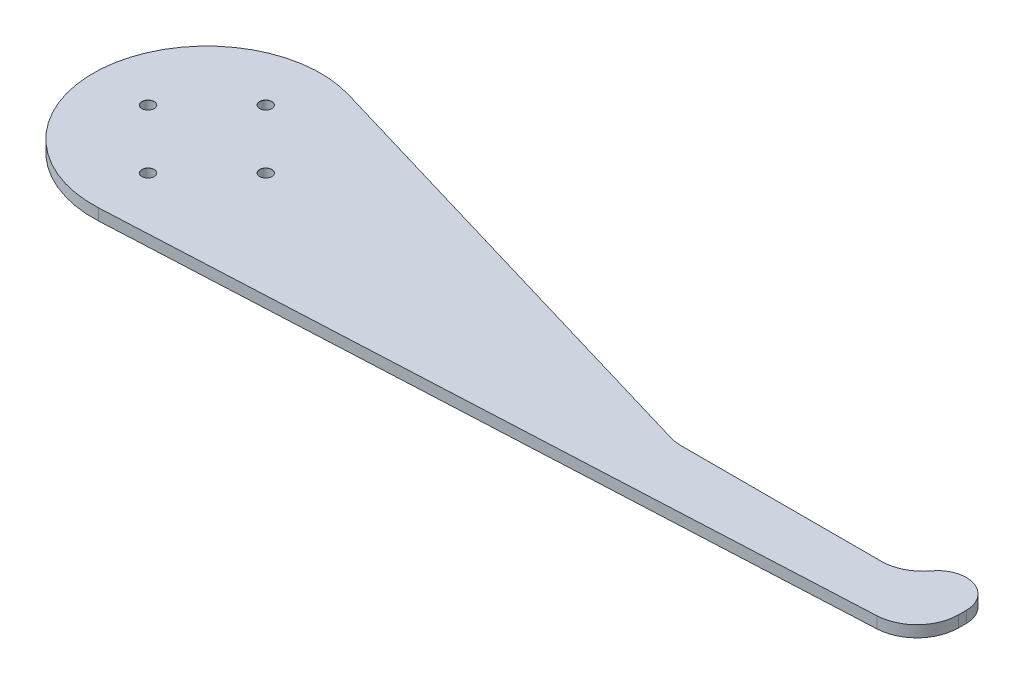
ISO-10303-21;
HEADER;
FILE_DESCRIPTION(('STEP AP214'),'2;1');
FILE_NAME('part.step','',(''),(''),'','','');
FILE_SCHEMA(('AUTOMOTIVE_DESIGN { 1 0 10303 214 1 1 1 1 }'));
ENDSEC;
DATA;
#1=APPLICATION_CONTEXT('core data for automotive mechanical design processes');
#2=APPLICATION_PROTOCOL_DEFINITION('international standard','automotive_design',2000,#1);
#3=PRODUCT_CONTEXT('',#1,'mechanical');
#4=PRODUCT('Part','Part','',(#3));
#5=PRODUCT_RELATED_PRODUCT_CATEGORY('part','',(#4));
#6=PRODUCT_DEFINITION_FORMATION('','',#4);
#7=PRODUCT_DEFINITION_CONTEXT('part definition',#1,'design');
#8=PRODUCT_DEFINITION('design','',#6,#7);
#9=PRODUCT_DEFINITION_SHAPE('','',#8);
#10=(LENGTH_UNIT() NAMED_UNIT(*) SI_UNIT(.MILLI.,.METRE.));
#11=(NAMED_UNIT(*) PLANE_ANGLE_UNIT() SI_UNIT($,.RADIAN.));
#12=(NAMED_UNIT(*) SI_UNIT($,.STERADIAN.) SOLID_ANGLE_UNIT());
#13=UNCERTAINTY_MEASURE_WITH_UNIT(LENGTH_MEASURE(1.E-05),#10,'distance_accuracy_value','');
#14=(GEOMETRIC_REPRESENTATION_CONTEXT(3) GLOBAL_UNCERTAINTY_ASSIGNED_CONTEXT((#13)) GLOBAL_UNIT_ASSIGNED_CONTEXT((#10,
#11,#12)) REPRESENTATION_CONTEXT('',''));
#15=CARTESIAN_POINT('',(0.,0.,0.));
#16=DIRECTION('',(0.,0.,1.));
#17=DIRECTION('',(1.,0.,0.));
#18=AXIS2_PLACEMENT_3D('',#15,#16,#17);
#19=CARTESIAN_POINT('',(0.,3.,0.));
#20=DIRECTION('',(0.,-1.,0.));
#21=DIRECTION('',(0.,0.,-1.));
#22=AXIS2_PLACEMENT_3D('',#19,#20,#21);
#23=CYLINDRICAL_SURFACE('',#22,30.);
#24=CARTESIAN_POINT('',(0.,0.,0.));
#25=DIRECTION('',(0.,1.,0.));
#26=DIRECTION('',(0.,0.,1.));
#27=AXIS2_PLACEMENT_3D('',#24,#25,#26);
#28=CIRCLE('',#27,30.);
#29=CARTESIAN_POINT('',(8.52962376563635,0.,-28.7618761282482));
#30=VERTEX_POINT('',#29);
#31=CARTESIAN_POINT('',(1.4504800602818,0.,29.9649146101691));
#32=VERTEX_POINT('',#31);
#33=EDGE_CURVE('E244',#30,#32,#28,.T.);
#34=ORIENTED_EDGE('',*,*,#33,.T.);
#35=DIRECTION('',(0.,-1.,0.));
#36=VECTOR('',#35,1.);
#37=CARTESIAN_POINT('',(1.4504800602818,3.,29.9649146101691));
#38=LINE('',#37,#36);
#39=CARTESIAN_POINT('',(1.4504800602818,3.,29.9649146101691));
#40=VERTEX_POINT('',#39);
#41=EDGE_CURVE('E149',#40,#32,#38,.T.);
#42=ORIENTED_EDGE('',*,*,#41,.F.);
#43=CARTESIAN_POINT('',(0.,3.,0.));
#44=DIRECTION('',(0.,1.,0.));
#45=DIRECTION('',(0.,0.,1.));
#46=AXIS2_PLACEMENT_3D('',#43,#44,#45);
#47=CIRCLE('',#46,30.);
#48=CARTESIAN_POINT('',(8.52962376563635,3.,-28.7618761282482));
#49=VERTEX_POINT('',#48);
#50=EDGE_CURVE('E135',#49,#40,#47,.T.);
#51=ORIENTED_EDGE('',*,*,#50,.F.);
#52=DIRECTION('',(0.,-1.,0.));
#53=VECTOR('',#52,1.);
#54=CARTESIAN_POINT('',(8.52962376563635,3.,-28.7618761282482));
#55=LINE('',#54,#53);
#56=EDGE_CURVE('E147',#49,#30,#55,.T.);
#57=ORIENTED_EDGE('',*,*,#56,.T.);
#58=EDGE_LOOP('',(#34,#42,#51,#57));
#59=FACE_BOUND('',#58,.T.);
#60=ADVANCED_FACE('F60',(#59),#23,.T.);
#61=CARTESIAN_POINT('',(1.4504800602818,3.,29.9649146101691));
#62=DIRECTION('',(0.0483493353427266,0.,0.998830487005636));
#63=DIRECTION('',(0.998830487005636,0.,-0.0483493353427266));
#64=AXIS2_PLACEMENT_3D('',#61,#62,#63);
#65=PLANE('',#64);
#66=DIRECTION('',(-0.998830487005636,0.,0.0483493353427266));
#67=VECTOR('',#66,1.);
#68=CARTESIAN_POINT('',(1.4504800602818,0.,29.9649146101691));
#69=LINE('',#68,#67);
#70=CARTESIAN_POINT('',(197.03184268877,0.,20.4976135900924));
#71=VERTEX_POINT('',#70);
#72=EDGE_CURVE('E246',#71,#32,#69,.T.);
#73=ORIENTED_EDGE('',*,*,#72,.F.);
#74=DIRECTION('',(0.,-1.,0.));
#75=VECTOR('',#74,1.);
#76=CARTESIAN_POINT('',(197.03184268877,3.,20.4976135900924));
#77=LINE('',#76,#75);
#78=CARTESIAN_POINT('',(197.03184268877,3.,20.4976135900924));
#79=VERTEX_POINT('',#78);
#80=EDGE_CURVE('E172',#71,#79,#77,.F.);
#81=ORIENTED_EDGE('',*,*,#80,.T.);
#82=DIRECTION('',(-0.998830487005636,0.,0.0483493353427266));
#83=VECTOR('',#82,1.);
#84=CARTESIAN_POINT('',(1.4504800602818,3.,29.9649146101691));
#85=LINE('',#84,#83);
#86=EDGE_CURVE('E150',#79,#40,#85,.T.);
#87=ORIENTED_EDGE('',*,*,#86,.T.);
#88=ORIENTED_EDGE('',*,*,#41,.T.);
#89=EDGE_LOOP('',(#73,#81,#87,#88));
#90=FACE_BOUND('',#89,.T.);
#91=ADVANCED_FACE('F203',(#90),#65,.T.);
#92=CARTESIAN_POINT('',(207.5,3.,0.));
#93=DIRECTION('',(1.,0.,0.));
#94=DIRECTION('',(0.,0.,-1.));
#95=AXIS2_PLACEMENT_3D('',#92,#93,#94);
#96=PLANE('',#95);
#97=DIRECTION('',(0.,0.,1.));
#98=VECTOR('',#97,1.);
#99=CARTESIAN_POINT('',(207.5,3.,0.));
#100=LINE('',#99,#98);
#101=CARTESIAN_POINT('',(207.5,3.,7.5));
#102=VERTEX_POINT('',#101);
#103=CARTESIAN_POINT('',(207.5,3.,9.51047823303036));
#104=VERTEX_POINT('',#103);
#105=EDGE_CURVE('E234',#102,#104,#100,.T.);
#106=ORIENTED_EDGE('',*,*,#105,.T.);
#107=DIRECTION('',(0.,-1.,0.));
#108=VECTOR('',#107,1.);
#109=CARTESIAN_POINT('',(207.5,3.,9.51047823303036));
#110=LINE('',#109,#108);
#111=CARTESIAN_POINT('',(207.5,0.,9.51047823303036));
#112=VERTEX_POINT('',#111);
#113=EDGE_CURVE('E156',#104,#112,#110,.T.);
#114=ORIENTED_EDGE('',*,*,#113,.T.);
#115=DIRECTION('',(0.,0.,1.));
#116=VECTOR('',#115,1.);
#117=CARTESIAN_POINT('',(207.5,0.,0.));
#118=LINE('',#117,#116);
#119=CARTESIAN_POINT('',(207.5,0.,7.5));
#120=VERTEX_POINT('',#119);
#121=EDGE_CURVE('E193',#120,#112,#118,.T.);
#122=ORIENTED_EDGE('',*,*,#121,.F.);
#123=DIRECTION('',(0.,-1.,0.));
#124=VECTOR('',#123,1.);
#125=CARTESIAN_POINT('',(207.5,3.,7.5));
#126=LINE('',#125,#124);
#127=EDGE_CURVE('E161',#102,#120,#126,.T.);
#128=ORIENTED_EDGE('',*,*,#127,.F.);
#129=EDGE_LOOP('',(#106,#114,#122,#128));
#130=FACE_BOUND('',#129,.T.);
#131=ADVANCED_FACE('F208',(#130),#96,.T.);
#132=CARTESIAN_POINT('',(0.,3.,7.5));
#133=DIRECTION('',(0.,0.,1.));
#134=DIRECTION('',(1.,0.,0.));
#135=AXIS2_PLACEMENT_3D('',#132,#133,#134);
#136=PLANE('',#135);
#137=DIRECTION('',(-1.,0.,0.));
#138=VECTOR('',#137,1.);
#139=CARTESIAN_POINT('',(0.,3.,7.5));
#140=LINE('',#139,#138);
#141=CARTESIAN_POINT('',(185.125525219356,3.,7.5));
#142=VERTEX_POINT('',#141);
#143=CARTESIAN_POINT('',(132.401318578778,3.,7.5));
#144=VERTEX_POINT('',#143);
#145=EDGE_CURVE('E238',#142,#144,#140,.T.);
#146=ORIENTED_EDGE('',*,*,#145,.F.);
#147=DIRECTION('',(0.,1.,0.));
#148=VECTOR('',#147,1.);
#149=CARTESIAN_POINT('',(185.125525219356,0.,7.5));
#150=LINE('',#149,#148);
#151=CARTESIAN_POINT('',(185.125525219356,0.,7.5));
#152=VERTEX_POINT('',#151);
#153=EDGE_CURVE('E177',#142,#152,#150,.F.);
#154=ORIENTED_EDGE('',*,*,#153,.T.);
#155=DIRECTION('',(-1.,0.,0.));
#156=VECTOR('',#155,1.);
#157=CARTESIAN_POINT('',(0.,0.,7.5));
#158=LINE('',#157,#156);
#159=CARTESIAN_POINT('',(132.401318578778,0.,7.5));
#160=VERTEX_POINT('',#159);
#161=EDGE_CURVE('E142',#152,#160,#158,.T.);
#162=ORIENTED_EDGE('',*,*,#161,.T.);
#163=DIRECTION('',(0.,-1.,0.));
#164=VECTOR('',#163,1.);
#165=CARTESIAN_POINT('',(132.401318578778,3.,7.5));
#166=LINE('',#165,#164);
#167=EDGE_CURVE('E75',#160,#144,#166,.F.);
#168=ORIENTED_EDGE('',*,*,#167,.T.);
#169=EDGE_LOOP('',(#146,#154,#162,#168));
#170=FACE_BOUND('',#169,.T.);
#171=ADVANCED_FACE('F191',(#170),#136,.F.);
#172=CARTESIAN_POINT('',(8.52962376563635,3.,-28.7618761282482));
#173=DIRECTION('',(-0.284320792187878,0.,0.958729204274939));
#174=DIRECTION('',(0.958729204274939,0.,0.284320792187878));
#175=AXIS2_PLACEMENT_3D('',#172,#173,#174);
#176=PLANE('',#175);
#177=DIRECTION('',(-0.958729204274939,0.,-0.284320792187878));
#178=VECTOR('',#177,1.);
#179=CARTESIAN_POINT('',(8.52962376563635,3.,-28.7618761282482));
#180=LINE('',#179,#178);
#181=CARTESIAN_POINT('',(129.273789864711,3.,7.04602124702433));
#182=VERTEX_POINT('',#181);
#183=EDGE_CURVE('E131',#182,#49,#180,.T.);
#184=ORIENTED_EDGE('',*,*,#183,.F.);
#185=DIRECTION('',(0.,-1.,0.));
#186=VECTOR('',#185,1.);
#187=CARTESIAN_POINT('',(129.273789864711,0.,7.04602124702433));
#188=LINE('',#187,#186);
#189=CARTESIAN_POINT('',(129.273789864711,0.,7.04602124702433));
#190=VERTEX_POINT('',#189);
#191=EDGE_CURVE('E182',#182,#190,#188,.T.);
#192=ORIENTED_EDGE('',*,*,#191,.T.);
#193=DIRECTION('',(-0.958729204274939,0.,-0.284320792187878));
#194=VECTOR('',#193,1.);
#195=CARTESIAN_POINT('',(8.52962376563635,0.,-28.7618761282482));
#196=LINE('',#195,#194);
#197=EDGE_CURVE('E154',#190,#30,#196,.T.);
#198=ORIENTED_EDGE('',*,*,#197,.T.);
#199=ORIENTED_EDGE('',*,*,#56,.F.);
#200=EDGE_LOOP('',(#184,#192,#198,#199));
#201=FACE_BOUND('',#200,.T.);
#202=ADVANCED_FACE('F152',(#201),#176,.F.);
#203=CARTESIAN_POINT('',(0.,0.,0.));
#204=DIRECTION('',(0.,1.,0.));
#205=DIRECTION('',(0.,0.,1.));
#206=AXIS2_PLACEMENT_3D('',#203,#204,#205);
#207=PLANE('',#206);
#208=CARTESIAN_POINT('',(0.,0.,-15.5));
#209=DIRECTION('',(0.,1.,0.));
#210=DIRECTION('',(0.,0.,1.));
#211=AXIS2_PLACEMENT_3D('',#208,#209,#210);
#212=CIRCLE('',#211,1.6);
#213=CARTESIAN_POINT('',(0.,0.,-13.9));
#214=VERTEX_POINT('',#213);
#215=EDGE_CURVE('E278',#214,#214,#212,.T.);
#216=ORIENTED_EDGE('',*,*,#215,.T.);
#217=EDGE_LOOP('',(#216));
#218=FACE_BOUND('',#217,.T.);
#219=CARTESIAN_POINT('',(15.5,0.,0.));
#220=DIRECTION('',(0.,1.,0.));
#221=DIRECTION('',(0.,0.,1.));
#222=AXIS2_PLACEMENT_3D('',#219,#220,#221);
#223=CIRCLE('',#222,1.6);
#224=CARTESIAN_POINT('',(15.5,0.,1.6));
#225=VERTEX_POINT('',#224);
#226=EDGE_CURVE('E269',#225,#225,#223,.T.);
#227=ORIENTED_EDGE('',*,*,#226,.T.);
#228=EDGE_LOOP('',(#227));
#229=FACE_BOUND('',#228,.T.);
#230=CARTESIAN_POINT('',(0.,0.,15.5));
#231=DIRECTION('',(0.,1.,0.));
#232=DIRECTION('',(0.,0.,1.));
#233=AXIS2_PLACEMENT_3D('',#230,#231,#232);
#234=CIRCLE('',#233,1.6);
#235=CARTESIAN_POINT('',(0.,0.,17.1));
#236=VERTEX_POINT('',#235);
#237=EDGE_CURVE('E260',#236,#236,#234,.T.);
#238=ORIENTED_EDGE('',*,*,#237,.T.);
#239=EDGE_LOOP('',(#238));
#240=FACE_BOUND('',#239,.T.);
#241=CARTESIAN_POINT('',(-15.5,0.,0.));
#242=DIRECTION('',(0.,1.,0.));
#243=DIRECTION('',(0.,0.,1.));
#244=AXIS2_PLACEMENT_3D('',#241,#242,#243);
#245=CIRCLE('',#244,1.6);
#246=CARTESIAN_POINT('',(-15.5,0.,1.6));
#247=VERTEX_POINT('',#246);
#248=EDGE_CURVE('E169',#247,#247,#245,.T.);
#249=ORIENTED_EDGE('',*,*,#248,.T.);
#250=EDGE_LOOP('',(#249));
#251=FACE_BOUND('',#250,.T.);
#252=ORIENTED_EDGE('',*,*,#121,.T.);
#253=CARTESIAN_POINT('',(196.5,0.,9.51047823303036));
#254=DIRECTION('',(0.,1.,0.));
#255=DIRECTION('',(0.,0.,1.));
#256=AXIS2_PLACEMENT_3D('',#253,#254,#255);
#257=CIRCLE('',#256,11.);
#258=EDGE_CURVE('E159',#112,#71,#257,.F.);
#259=ORIENTED_EDGE('',*,*,#258,.T.);
#260=ORIENTED_EDGE('',*,*,#72,.T.);
#261=ORIENTED_EDGE('',*,*,#33,.F.);
#262=ORIENTED_EDGE('',*,*,#197,.F.);
#263=CARTESIAN_POINT('',(132.401318578778,0.,-3.5));
#264=DIRECTION('',(0.,1.,0.));
#265=DIRECTION('',(0.,0.,1.));
#266=AXIS2_PLACEMENT_3D('',#263,#264,#265);
#267=CIRCLE('',#266,11.);
#268=EDGE_CURVE('E68',#190,#160,#267,.T.);
#269=ORIENTED_EDGE('',*,*,#268,.T.);
#270=ORIENTED_EDGE('',*,*,#161,.F.);
#271=CARTESIAN_POINT('',(185.125525219356,0.,-3.5));
#272=DIRECTION('',(0.,1.,0.));
#273=DIRECTION('',(0.,0.,1.));
#274=AXIS2_PLACEMENT_3D('',#271,#272,#273);
#275=CIRCLE('',#274,11.);
#276=CARTESIAN_POINT('',(193.969807521361,0.,3.04054054054054));
#277=VERTEX_POINT('',#276);
#278=EDGE_CURVE('E184',#152,#277,#275,.T.);
#279=ORIENTED_EDGE('',*,*,#278,.T.);
#280=CARTESIAN_POINT('',(200.,0.,7.5));
#281=DIRECTION('',(0.,1.,0.));
#282=DIRECTION('',(0.,0.,1.));
#283=AXIS2_PLACEMENT_3D('',#280,#281,#282);
#284=CIRCLE('',#283,7.50000000000001);
#285=EDGE_CURVE('E167',#120,#277,#284,.T.);
#286=ORIENTED_EDGE('',*,*,#285,.F.);
#287=EDGE_LOOP('',(#252,#259,#260,#261,#262,#269,#270,#279,#286));
#288=FACE_BOUND('',#287,.T.);
#289=ADVANCED_FACE('F189',(#218,#229,#240,#251,#288),#207,.F.);
#290=CARTESIAN_POINT('',(0.,3.,0.));
#291=DIRECTION('',(0.,1.,0.));
#292=DIRECTION('',(0.,0.,1.));
#293=AXIS2_PLACEMENT_3D('',#290,#291,#292);
#294=PLANE('',#293);
#295=CARTESIAN_POINT('',(0.,3.,-15.5));
#296=DIRECTION('',(0.,1.,0.));
#297=DIRECTION('',(0.,0.,1.));
#298=AXIS2_PLACEMENT_3D('',#295,#296,#297);
#299=CIRCLE('',#298,1.625);
#300=CARTESIAN_POINT('',(0.,3.,-13.875));
#301=VERTEX_POINT('',#300);
#302=EDGE_CURVE('E284',#301,#301,#299,.T.);
#303=ORIENTED_EDGE('',*,*,#302,.F.);
#304=EDGE_LOOP('',(#303));
#305=FACE_BOUND('',#304,.T.);
#306=CARTESIAN_POINT('',(15.5,3.,0.));
#307=DIRECTION('',(0.,1.,0.));
#308=DIRECTION('',(0.,0.,1.));
#309=AXIS2_PLACEMENT_3D('',#306,#307,#308);
#310=CIRCLE('',#309,1.625);
#311=CARTESIAN_POINT('',(15.5,3.,1.625));
#312=VERTEX_POINT('',#311);
#313=EDGE_CURVE('E275',#312,#312,#310,.T.);
#314=ORIENTED_EDGE('',*,*,#313,.F.);
#315=EDGE_LOOP('',(#314));
#316=FACE_BOUND('',#315,.T.);
#317=CARTESIAN_POINT('',(0.,3.,15.5));
#318=DIRECTION('',(0.,1.,0.));
#319=DIRECTION('',(0.,0.,1.));
#320=AXIS2_PLACEMENT_3D('',#317,#318,#319);
#321=CIRCLE('',#320,1.625);
#322=CARTESIAN_POINT('',(0.,3.,17.125));
#323=VERTEX_POINT('',#322);
#324=EDGE_CURVE('E266',#323,#323,#321,.T.);
#325=ORIENTED_EDGE('',*,*,#324,.F.);
#326=EDGE_LOOP('',(#325));
#327=FACE_BOUND('',#326,.T.);
#328=CARTESIAN_POINT('',(-15.5,3.,0.));
#329=DIRECTION('',(0.,1.,0.));
#330=DIRECTION('',(0.,0.,1.));
#331=AXIS2_PLACEMENT_3D('',#328,#329,#330);
#332=CIRCLE('',#331,1.625);
#333=CARTESIAN_POINT('',(-15.5,3.,1.625));
#334=VERTEX_POINT('',#333);
#335=EDGE_CURVE('E257',#334,#334,#332,.T.);
#336=ORIENTED_EDGE('',*,*,#335,.F.);
#337=EDGE_LOOP('',(#336));
#338=FACE_BOUND('',#337,.T.);
#339=ORIENTED_EDGE('',*,*,#86,.F.);
#340=CARTESIAN_POINT('',(196.5,3.,9.51047823303036));
#341=DIRECTION('',(0.,1.,0.));
#342=DIRECTION('',(0.,0.,1.));
#343=AXIS2_PLACEMENT_3D('',#340,#341,#342);
#344=CIRCLE('',#343,11.);
#345=EDGE_CURVE('E174',#79,#104,#344,.T.);
#346=ORIENTED_EDGE('',*,*,#345,.T.);
#347=ORIENTED_EDGE('',*,*,#105,.F.);
#348=CARTESIAN_POINT('',(200.,3.,7.5));
#349=DIRECTION('',(0.,1.,0.));
#350=DIRECTION('',(0.,0.,1.));
#351=AXIS2_PLACEMENT_3D('',#348,#349,#350);
#352=CIRCLE('',#351,7.50000000000001);
#353=CARTESIAN_POINT('',(193.969807521361,3.,3.04054054054054));
#354=VERTEX_POINT('',#353);
#355=EDGE_CURVE('E165',#102,#354,#352,.T.);
#356=ORIENTED_EDGE('',*,*,#355,.T.);
#357=CARTESIAN_POINT('',(185.125525219356,3.,-3.5));
#358=DIRECTION('',(0.,1.,0.));
#359=DIRECTION('',(0.,0.,1.));
#360=AXIS2_PLACEMENT_3D('',#357,#358,#359);
#361=CIRCLE('',#360,11.);
#362=EDGE_CURVE('E82',#354,#142,#361,.F.);
#363=ORIENTED_EDGE('',*,*,#362,.T.);
#364=ORIENTED_EDGE('',*,*,#145,.T.);
#365=CARTESIAN_POINT('',(132.401318578778,3.,-3.5));
#366=DIRECTION('',(0.,1.,0.));
#367=DIRECTION('',(0.,0.,1.));
#368=AXIS2_PLACEMENT_3D('',#365,#366,#367);
#369=CIRCLE('',#368,11.);
#370=EDGE_CURVE('E12',#144,#182,#369,.F.);
#371=ORIENTED_EDGE('',*,*,#370,.T.);
#372=ORIENTED_EDGE('',*,*,#183,.T.);
#373=ORIENTED_EDGE('',*,*,#50,.T.);
#374=EDGE_LOOP('',(#339,#346,#347,#356,#363,#364,#371,#372,#373));
#375=FACE_BOUND('',#374,.T.);
#376=ADVANCED_FACE('F134',(#305,#316,#327,#338,#375),#294,.T.);
#377=CARTESIAN_POINT('',(200.,3.,7.5));
#378=DIRECTION('',(0.,-1.,0.));
#379=DIRECTION('',(0.,0.,-1.));
#380=AXIS2_PLACEMENT_3D('',#377,#378,#379);
#381=CYLINDRICAL_SURFACE('',#380,7.50000000000001);
#382=ORIENTED_EDGE('',*,*,#285,.T.);
#383=DIRECTION('',(0.,-1.,0.));
#384=VECTOR('',#383,1.);
#385=CARTESIAN_POINT('',(193.969807521361,3.,3.04054054054054));
#386=LINE('',#385,#384);
#387=EDGE_CURVE('E180',#277,#354,#386,.F.);
#388=ORIENTED_EDGE('',*,*,#387,.T.);
#389=ORIENTED_EDGE('',*,*,#355,.F.);
#390=ORIENTED_EDGE('',*,*,#127,.T.);
#391=EDGE_LOOP('',(#382,#388,#389,#390));
#392=FACE_BOUND('',#391,.T.);
#393=ADVANCED_FACE('F215',(#392),#381,.T.);
#394=CARTESIAN_POINT('',(-15.5,3.,0.));
#395=DIRECTION('',(0.,1.,0.));
#396=DIRECTION('',(0.,0.,1.));
#397=AXIS2_PLACEMENT_3D('',#394,#395,#396);
#398=CYLINDRICAL_SURFACE('',#397,1.6);
#399=ORIENTED_EDGE('',*,*,#248,.F.);
#400=EDGE_LOOP('',(#399));
#401=FACE_BOUND('',#400,.T.);
#402=CARTESIAN_POINT('',(-15.5,2.975,0.));
#403=DIRECTION('',(0.,1.,0.));
#404=DIRECTION('',(0.,0.,1.));
#405=AXIS2_PLACEMENT_3D('',#402,#403,#404);
#406=CIRCLE('',#405,1.6);
#407=CARTESIAN_POINT('',(-15.5,2.975,1.6));
#408=VERTEX_POINT('',#407);
#409=EDGE_CURVE('E254',#408,#408,#406,.T.);
#410=ORIENTED_EDGE('',*,*,#409,.T.);
#411=EDGE_LOOP('',(#410));
#412=FACE_BOUND('',#411,.T.);
#413=ADVANCED_FACE('F218',(#401,#412),#398,.F.);
#414=CARTESIAN_POINT('',(-15.5,3.,0.));
#415=DIRECTION('',(0.,1.,0.));
#416=DIRECTION('',(0.,0.,1.));
#417=AXIS2_PLACEMENT_3D('',#414,#415,#416);
#418=CONICAL_SURFACE('',#417,1.625,0.785398163397396);
#419=ORIENTED_EDGE('',*,*,#409,.F.);
#420=EDGE_LOOP('',(#419));
#421=FACE_BOUND('',#420,.T.);
#422=ORIENTED_EDGE('',*,*,#335,.T.);
#423=EDGE_LOOP('',(#422));
#424=FACE_BOUND('',#423,.T.);
#425=ADVANCED_FACE('F298',(#421,#424),#418,.F.);
#426=CARTESIAN_POINT('',(0.,3.,15.5));
#427=DIRECTION('',(0.,1.,0.));
#428=DIRECTION('',(0.,0.,1.));
#429=AXIS2_PLACEMENT_3D('',#426,#427,#428);
#430=CYLINDRICAL_SURFACE('',#429,1.6);
#431=ORIENTED_EDGE('',*,*,#237,.F.);
#432=EDGE_LOOP('',(#431));
#433=FACE_BOUND('',#432,.T.);
#434=CARTESIAN_POINT('',(0.,2.975,15.5));
#435=DIRECTION('',(0.,1.,0.));
#436=DIRECTION('',(0.,0.,1.));
#437=AXIS2_PLACEMENT_3D('',#434,#435,#436);
#438=CIRCLE('',#437,1.6);
#439=CARTESIAN_POINT('',(0.,2.975,17.1));
#440=VERTEX_POINT('',#439);
#441=EDGE_CURVE('E263',#440,#440,#438,.T.);
#442=ORIENTED_EDGE('',*,*,#441,.T.);
#443=EDGE_LOOP('',(#442));
#444=FACE_BOUND('',#443,.T.);
#445=ADVANCED_FACE('F300',(#433,#444),#430,.F.);
#446=CARTESIAN_POINT('',(0.,3.,15.5));
#447=DIRECTION('',(0.,1.,0.));
#448=DIRECTION('',(0.,0.,1.));
#449=AXIS2_PLACEMENT_3D('',#446,#447,#448);
#450=CONICAL_SURFACE('',#449,1.625,0.785398163397418);
#451=ORIENTED_EDGE('',*,*,#441,.F.);
#452=EDGE_LOOP('',(#451));
#453=FACE_BOUND('',#452,.T.);
#454=ORIENTED_EDGE('',*,*,#324,.T.);
#455=EDGE_LOOP('',(#454));
#456=FACE_BOUND('',#455,.T.);
#457=ADVANCED_FACE('F307',(#453,#456),#450,.F.);
#458=CARTESIAN_POINT('',(15.5,3.,0.));
#459=DIRECTION('',(0.,1.,0.));
#460=DIRECTION('',(0.,0.,1.));
#461=AXIS2_PLACEMENT_3D('',#458,#459,#460);
#462=CYLINDRICAL_SURFACE('',#461,1.6);
#463=ORIENTED_EDGE('',*,*,#226,.F.);
#464=EDGE_LOOP('',(#463));
#465=FACE_BOUND('',#464,.T.);
#466=CARTESIAN_POINT('',(15.5,2.975,0.));
#467=DIRECTION('',(0.,1.,0.));
#468=DIRECTION('',(0.,0.,1.));
#469=AXIS2_PLACEMENT_3D('',#466,#467,#468);
#470=CIRCLE('',#469,1.6);
#471=CARTESIAN_POINT('',(15.5,2.975,1.6));
#472=VERTEX_POINT('',#471);
#473=EDGE_CURVE('E272',#472,#472,#470,.T.);
#474=ORIENTED_EDGE('',*,*,#473,.T.);
#475=EDGE_LOOP('',(#474));
#476=FACE_BOUND('',#475,.T.);
#477=ADVANCED_FACE('F372',(#465,#476),#462,.F.);
#478=CARTESIAN_POINT('',(15.5,3.,0.));
#479=DIRECTION('',(0.,1.,0.));
#480=DIRECTION('',(0.,0.,1.));
#481=AXIS2_PLACEMENT_3D('',#478,#479,#480);
#482=CONICAL_SURFACE('',#481,1.625,0.785398163397431);
#483=ORIENTED_EDGE('',*,*,#473,.F.);
#484=EDGE_LOOP('',(#483));
#485=FACE_BOUND('',#484,.T.);
#486=ORIENTED_EDGE('',*,*,#313,.T.);
#487=EDGE_LOOP('',(#486));
#488=FACE_BOUND('',#487,.T.);
#489=ADVANCED_FACE('F382',(#485,#488),#482,.F.);
#490=CARTESIAN_POINT('',(0.,3.,-15.5));
#491=DIRECTION('',(0.,1.,0.));
#492=DIRECTION('',(0.,0.,1.));
#493=AXIS2_PLACEMENT_3D('',#490,#491,#492);
#494=CYLINDRICAL_SURFACE('',#493,1.6);
#495=ORIENTED_EDGE('',*,*,#215,.F.);
#496=EDGE_LOOP('',(#495));
#497=FACE_BOUND('',#496,.T.);
#498=CARTESIAN_POINT('',(0.,2.975,-15.5));
#499=DIRECTION('',(0.,1.,0.));
#500=DIRECTION('',(0.,0.,1.));
#501=AXIS2_PLACEMENT_3D('',#498,#499,#500);
#502=CIRCLE('',#501,1.6);
#503=CARTESIAN_POINT('',(0.,2.975,-13.9));
#504=VERTEX_POINT('',#503);
#505=EDGE_CURVE('E281',#504,#504,#502,.T.);
#506=ORIENTED_EDGE('',*,*,#505,.T.);
#507=EDGE_LOOP('',(#506));
#508=FACE_BOUND('',#507,.T.);
#509=ADVANCED_FACE('F226',(#497,#508),#494,.F.);
#510=CARTESIAN_POINT('',(0.,3.,-15.5));
#511=DIRECTION('',(0.,1.,0.));
#512=DIRECTION('',(0.,0.,1.));
#513=AXIS2_PLACEMENT_3D('',#510,#511,#512);
#514=CONICAL_SURFACE('',#513,1.625,0.785398163397418);
#515=ORIENTED_EDGE('',*,*,#505,.F.);
#516=EDGE_LOOP('',(#515));
#517=FACE_BOUND('',#516,.T.);
#518=ORIENTED_EDGE('',*,*,#302,.T.);
#519=EDGE_LOOP('',(#518));
#520=FACE_BOUND('',#519,.T.);
#521=ADVANCED_FACE('F221',(#517,#520),#514,.F.);
#522=CARTESIAN_POINT('',(196.5,3.,9.51047823303036));
#523=DIRECTION('',(0.,-1.,0.));
#524=DIRECTION('',(0.,0.,-1.));
#525=AXIS2_PLACEMENT_3D('',#522,#523,#524);
#526=CYLINDRICAL_SURFACE('',#525,11.);
#527=ORIENTED_EDGE('',*,*,#345,.F.);
#528=ORIENTED_EDGE('',*,*,#80,.F.);
#529=ORIENTED_EDGE('',*,*,#258,.F.);
#530=ORIENTED_EDGE('',*,*,#113,.F.);
#531=EDGE_LOOP('',(#527,#528,#529,#530));
#532=FACE_BOUND('',#531,.T.);
#533=ADVANCED_FACE('F200',(#532),#526,.T.);
#534=CARTESIAN_POINT('',(185.125525219356,3.,-3.5));
#535=DIRECTION('',(0.,-1.,0.));
#536=DIRECTION('',(0.,0.,-1.));
#537=AXIS2_PLACEMENT_3D('',#534,#535,#536);
#538=CYLINDRICAL_SURFACE('',#537,11.);
#539=ORIENTED_EDGE('',*,*,#362,.F.);
#540=ORIENTED_EDGE('',*,*,#387,.F.);
#541=ORIENTED_EDGE('',*,*,#278,.F.);
#542=ORIENTED_EDGE('',*,*,#153,.F.);
#543=EDGE_LOOP('',(#539,#540,#541,#542));
#544=FACE_BOUND('',#543,.T.);
#545=ADVANCED_FACE('F196',(#544),#538,.F.);
#546=CARTESIAN_POINT('',(132.401318578778,3.,-3.5));
#547=DIRECTION('',(0.,1.,0.));
#548=DIRECTION('',(0.,0.,1.));
#549=AXIS2_PLACEMENT_3D('',#546,#547,#548);
#550=CYLINDRICAL_SURFACE('',#549,11.);
#551=ORIENTED_EDGE('',*,*,#370,.F.);
#552=ORIENTED_EDGE('',*,*,#167,.F.);
#553=ORIENTED_EDGE('',*,*,#268,.F.);
#554=ORIENTED_EDGE('',*,*,#191,.F.);
#555=EDGE_LOOP('',(#551,#552,#553,#554));
#556=FACE_BOUND('',#555,.T.);
#557=ADVANCED_FACE('F62',(#556),#550,.F.);
#558=CLOSED_SHELL('',(#60,#91,#131,#171,#202,#289,#376,#393,#413,#425,#445,#457,#477,#489,#509,
#521,#533,#545,#557));
#559=MANIFOLD_SOLID_BREP('B2',#558);
#560=ADVANCED_BREP_SHAPE_REPRESENTATION('',(#18,#559),#14);
#561=SHAPE_DEFINITION_REPRESENTATION(#9,#560);
ENDSEC;
END-ISO-10303-21;
